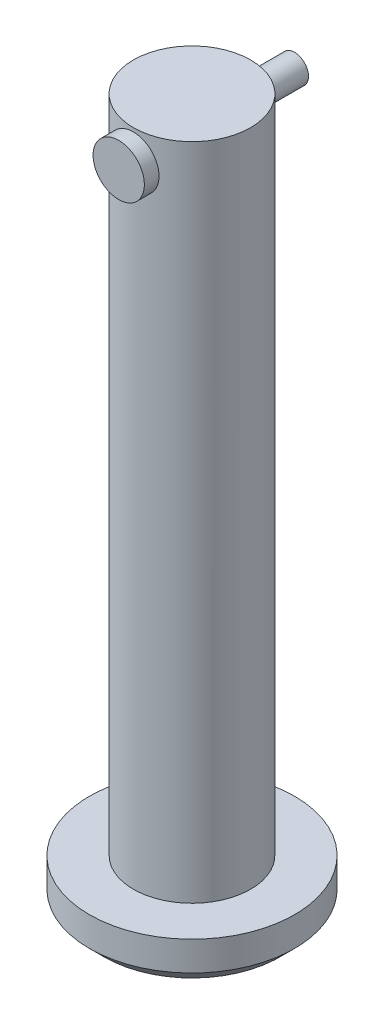
ISO-10303-21;
HEADER;
FILE_DESCRIPTION(('STEP AP214'),'2;1');
FILE_NAME('part.step','',(''),(''),'','','');
FILE_SCHEMA(('AUTOMOTIVE_DESIGN { 1 0 10303 214 1 1 1 1 }'));
ENDSEC;
DATA;
#1=APPLICATION_CONTEXT('core data for automotive mechanical design processes');
#2=APPLICATION_PROTOCOL_DEFINITION('international standard','automotive_design',2000,#1);
#3=PRODUCT_CONTEXT('',#1,'mechanical');
#4=PRODUCT('Part','Part','',(#3));
#5=PRODUCT_RELATED_PRODUCT_CATEGORY('part','',(#4));
#6=PRODUCT_DEFINITION_FORMATION('','',#4);
#7=PRODUCT_DEFINITION_CONTEXT('part definition',#1,'design');
#8=PRODUCT_DEFINITION('design','',#6,#7);
#9=PRODUCT_DEFINITION_SHAPE('','',#8);
#10=(LENGTH_UNIT() NAMED_UNIT(*) SI_UNIT(.MILLI.,.METRE.));
#11=(NAMED_UNIT(*) PLANE_ANGLE_UNIT() SI_UNIT($,.RADIAN.));
#12=(NAMED_UNIT(*) SI_UNIT($,.STERADIAN.) SOLID_ANGLE_UNIT());
#13=UNCERTAINTY_MEASURE_WITH_UNIT(LENGTH_MEASURE(1.E-05),#10,'distance_accuracy_value','');
#14=(GEOMETRIC_REPRESENTATION_CONTEXT(3) GLOBAL_UNCERTAINTY_ASSIGNED_CONTEXT((#13)) GLOBAL_UNIT_ASSIGNED_CONTEXT((#10,
#11,#12)) REPRESENTATION_CONTEXT('',''));
#15=CARTESIAN_POINT('',(0.,0.,0.));
#16=DIRECTION('',(0.,0.,1.));
#17=DIRECTION('',(1.,0.,0.));
#18=AXIS2_PLACEMENT_3D('',#15,#16,#17);
#19=CARTESIAN_POINT('',(0.,43.,-7.));
#20=DIRECTION('',(0.,0.,1.));
#21=DIRECTION('',(1.,0.,0.));
#22=AXIS2_PLACEMENT_3D('',#19,#20,#21);
#23=CYLINDRICAL_SURFACE('',#22,0.95);
#24=CARTESIAN_POINT('',(0.,43.,-7.));
#25=DIRECTION('',(0.,0.,1.));
#26=DIRECTION('',(1.,0.,0.));
#27=AXIS2_PLACEMENT_3D('',#24,#25,#26);
#28=CIRCLE('',#27,0.95);
#29=CARTESIAN_POINT('',(0.95,43.,-7.));
#30=VERTEX_POINT('',#29);
#31=EDGE_CURVE('E11',#30,#30,#28,.T.);
#32=ORIENTED_EDGE('',*,*,#31,.T.);
#33=EDGE_LOOP('',(#32));
#34=FACE_BOUND('',#33,.T.);
#35=CARTESIAN_POINT('',(0.,43.,4.));
#36=DIRECTION('',(0.,0.,1.));
#37=DIRECTION('',(1.,0.,0.));
#38=AXIS2_PLACEMENT_3D('',#35,#36,#37);
#39=CIRCLE('',#38,0.95);
#40=CARTESIAN_POINT('',(0.95,43.,4.));
#41=VERTEX_POINT('',#40);
#42=EDGE_CURVE('E41',#41,#41,#39,.F.);
#43=ORIENTED_EDGE('',*,*,#42,.T.);
#44=EDGE_LOOP('',(#43));
#45=FACE_BOUND('',#44,.T.);
#46=ADVANCED_FACE('F38',(#34,#45),#23,.T.);
#47=CARTESIAN_POINT('',(0.,43.,-7.));
#48=DIRECTION('',(0.,0.,1.));
#49=DIRECTION('',(1.,0.,0.));
#50=AXIS2_PLACEMENT_3D('',#47,#48,#49);
#51=PLANE('',#50);
#52=ORIENTED_EDGE('',*,*,#31,.F.);
#53=EDGE_LOOP('',(#52));
#54=FACE_BOUND('',#53,.T.);
#55=ADVANCED_FACE('F70',(#54),#51,.F.);
#56=CARTESIAN_POINT('',(0.,43.,4.));
#57=DIRECTION('',(0.,0.,1.));
#58=DIRECTION('',(1.,0.,0.));
#59=AXIS2_PLACEMENT_3D('',#56,#57,#58);
#60=CYLINDRICAL_SURFACE('',#59,1.75);
#61=CARTESIAN_POINT('',(0.,43.,4.));
#62=DIRECTION('',(0.,0.,1.));
#63=DIRECTION('',(1.,0.,0.));
#64=AXIS2_PLACEMENT_3D('',#61,#62,#63);
#65=CIRCLE('',#64,1.75);
#66=CARTESIAN_POINT('',(1.75,43.,4.));
#67=VERTEX_POINT('',#66);
#68=EDGE_CURVE('E48',#67,#67,#65,.T.);
#69=ORIENTED_EDGE('',*,*,#68,.T.);
#70=EDGE_LOOP('',(#69));
#71=FACE_BOUND('',#70,.T.);
#72=CARTESIAN_POINT('',(0.,43.,5.));
#73=DIRECTION('',(0.,0.,1.));
#74=DIRECTION('',(1.,0.,0.));
#75=AXIS2_PLACEMENT_3D('',#72,#73,#74);
#76=CIRCLE('',#75,1.75);
#77=CARTESIAN_POINT('',(1.75,43.,5.));
#78=VERTEX_POINT('',#77);
#79=EDGE_CURVE('E50',#78,#78,#76,.T.);
#80=ORIENTED_EDGE('',*,*,#79,.F.);
#81=EDGE_LOOP('',(#80));
#82=FACE_BOUND('',#81,.T.);
#83=ADVANCED_FACE('F56',(#71,#82),#60,.T.);
#84=CARTESIAN_POINT('',(0.,43.,4.));
#85=DIRECTION('',(0.,0.,1.));
#86=DIRECTION('',(1.,0.,0.));
#87=AXIS2_PLACEMENT_3D('',#84,#85,#86);
#88=PLANE('',#87);
#89=ORIENTED_EDGE('',*,*,#42,.F.);
#90=EDGE_LOOP('',(#89));
#91=FACE_BOUND('',#90,.T.);
#92=ORIENTED_EDGE('',*,*,#68,.F.);
#93=EDGE_LOOP('',(#92));
#94=FACE_BOUND('',#93,.T.);
#95=ADVANCED_FACE('F59',(#91,#94),#88,.F.);
#96=CARTESIAN_POINT('',(0.,43.,5.));
#97=DIRECTION('',(0.,0.,1.));
#98=DIRECTION('',(1.,0.,0.));
#99=AXIS2_PLACEMENT_3D('',#96,#97,#98);
#100=PLANE('',#99);
#101=ORIENTED_EDGE('',*,*,#79,.T.);
#102=EDGE_LOOP('',(#101));
#103=FACE_BOUND('',#102,.T.);
#104=ADVANCED_FACE('F61',(#103),#100,.T.);
#105=CLOSED_SHELL('',(#46,#55,#83,#95,#104));
#106=MANIFOLD_SOLID_BREP('B2',#105);
#107=CARTESIAN_POINT('',(0.,45.,0.));
#108=DIRECTION('',(0.,-1.,0.));
#109=DIRECTION('',(0.,0.,-1.));
#110=AXIS2_PLACEMENT_3D('',#107,#108,#109);
#111=CYLINDRICAL_SURFACE('',#110,4.);
#112=CARTESIAN_POINT('',(0.,45.,0.));
#113=DIRECTION('',(0.,1.,0.));
#114=DIRECTION('',(0.,0.,1.));
#115=AXIS2_PLACEMENT_3D('',#112,#113,#114);
#116=CIRCLE('',#115,4.);
#117=CARTESIAN_POINT('',(0.,45.,4.));
#118=VERTEX_POINT('',#117);
#119=EDGE_CURVE('E128',#118,#118,#116,.T.);
#120=ORIENTED_EDGE('',*,*,#119,.F.);
#121=EDGE_LOOP('',(#120));
#122=FACE_BOUND('',#121,.T.);
#123=CARTESIAN_POINT('',(0.,0.,0.));
#124=DIRECTION('',(0.,-1.,0.));
#125=DIRECTION('',(0.,0.,-1.));
#126=AXIS2_PLACEMENT_3D('',#123,#124,#125);
#127=CIRCLE('',#126,4.);
#128=CARTESIAN_POINT('',(0.,0.,-4.));
#129=VERTEX_POINT('',#128);
#130=EDGE_CURVE('E163',#129,#129,#127,.T.);
#131=ORIENTED_EDGE('',*,*,#130,.F.);
#132=EDGE_LOOP('',(#131));
#133=FACE_BOUND('',#132,.T.);
#134=CARTESIAN_POINT('',(-1.,43.,3.87298334620742));
#135=CARTESIAN_POINT('',(-0.9999984314387,42.9447796996432,3.87298440057185));
#136=CARTESIAN_POINT('',(-0.99541049820807,42.8895420405686,3.87417722499278));
#137=CARTESIAN_POINT('',(-0.977209250194448,42.7806529687674,3.87880744892249));
#138=CARTESIAN_POINT('',(-0.963590682698079,42.72700249822,3.8822461547418));
#139=CARTESIAN_POINT('',(-0.927796479849635,42.6228785847122,3.89095489813012));
#140=CARTESIAN_POINT('',(-0.905631891140941,42.5724011378422,3.8962225706936));
#141=CARTESIAN_POINT('',(-0.853408456505403,42.4758756589875,3.90799276818327));
#142=CARTESIAN_POINT('',(-0.823349275424503,42.4298278151688,3.91449534553241));
#143=CARTESIAN_POINT('',(-0.755483370924518,42.3424553418942,3.92816286540368));
#144=CARTESIAN_POINT('',(-0.717534755081558,42.3012425598597,3.93533839048709));
#145=CARTESIAN_POINT('',(-0.635272825640328,42.2256954422561,3.94945150206622));
#146=CARTESIAN_POINT('',(-0.59095891767214,42.1913617497514,3.95638906626691));
#147=CARTESIAN_POINT('',(-0.496458080431566,42.1300898129474,3.96936166208095));
#148=CARTESIAN_POINT('',(-0.446197830478045,42.1032614447354,3.975382749602));
#149=CARTESIAN_POINT('',(-0.341705273717112,42.0584761423388,3.9857232477043));
#150=CARTESIAN_POINT('',(-0.28747355431678,42.0405178992338,3.99004290933747));
#151=CARTESIAN_POINT('',(-0.177743503501667,42.0143408661686,3.99641903539262));
#152=CARTESIAN_POINT('',(-0.122293087819594,42.0059321422694,3.99851957537723));
#153=CARTESIAN_POINT('',(-0.0107315277051117,41.9984966482898,4.00037437642922));
#154=CARTESIAN_POINT('',(0.045379517815224,41.9994684911162,4.00012898438682));
#155=CARTESIAN_POINT('',(0.155352247172384,42.0106299401001,3.99735237981413));
#156=CARTESIAN_POINT('',(0.209236215601063,42.0206145300215,3.99487200936349));
#157=CARTESIAN_POINT('',(0.314538247413682,42.0491885080194,3.98796334609942));
#158=CARTESIAN_POINT('',(0.365956179370435,42.067778354151,3.98353494959376));
#159=CARTESIAN_POINT('',(0.465406703501804,42.1132010282748,3.97315003880358));
#160=CARTESIAN_POINT('',(0.513404509766501,42.1401068178647,3.96718007878021));
#161=CARTESIAN_POINT('',(0.604275622340485,42.2013422716465,3.9543596152386));
#162=CARTESIAN_POINT('',(0.647148035085502,42.2356732274242,3.94750895860996));
#163=CARTESIAN_POINT('',(0.727774035084955,42.3118834967929,3.93345485507808));
#164=CARTESIAN_POINT('',(0.765357679075198,42.3539419569391,3.92624687810367));
#165=CARTESIAN_POINT('',(0.832976375963017,42.4438399894161,3.91246017406683));
#166=CARTESIAN_POINT('',(0.863011076046014,42.4916798317964,3.90588147642388));
#167=CARTESIAN_POINT('',(0.914788129022598,42.5921160136596,3.89408198732659));
#168=CARTESIAN_POINT('',(0.936489566970493,42.6447342921253,3.88886793490288));
#169=CARTESIAN_POINT('',(0.970685620636343,42.7530341872306,3.88047456055983));
#170=CARTESIAN_POINT('',(0.983182206552911,42.8087151455933,3.87729480324087));
#171=CARTESIAN_POINT('',(0.998331855466071,42.9199838006092,3.87342142415656));
#172=CARTESIAN_POINT('',(1.00123618956785,42.9755351173318,3.87266435637459));
#173=CARTESIAN_POINT('',(0.99780679620622,43.0863287746313,3.87354937392416));
#174=CARTESIAN_POINT('',(0.991473919139521,43.1415711431805,3.87519123840506));
#175=CARTESIAN_POINT('',(0.969970185575067,43.2492457059819,3.88062832781824));
#176=CARTESIAN_POINT('',(0.954945627312701,43.3017090906283,3.8843878809375));
#177=CARTESIAN_POINT('',(0.916647232668251,43.4033725831407,3.89360287308385));
#178=CARTESIAN_POINT('',(0.89337241908502,43.4525723036221,3.89905851299445));
#179=CARTESIAN_POINT('',(0.838708267174625,43.5473765111469,3.91118454837305));
#180=CARTESIAN_POINT('',(0.807168701534253,43.5928915360172,3.91787667442657));
#181=CARTESIAN_POINT('',(0.737060292934457,43.6780753451205,3.93166833228686));
#182=CARTESIAN_POINT('',(0.698490294805439,43.71774316666,3.93876793091388));
#183=CARTESIAN_POINT('',(0.614262720984724,43.7911244170284,3.95278961212643));
#184=CARTESIAN_POINT('',(0.568451952531592,43.8246640250195,3.95970280824734));
#185=CARTESIAN_POINT('',(0.471702682694676,43.8835743467805,3.97238886645494));
#186=CARTESIAN_POINT('',(0.420764448957593,43.9089454866433,3.97816178801584));
#187=CARTESIAN_POINT('',(0.315558201731094,43.9505784138112,3.98788046295326));
#188=CARTESIAN_POINT('',(0.261317381027885,43.9669057137516,3.99183932008964));
#189=CARTESIAN_POINT('',(0.150749760318812,43.9901841338434,3.99754117358315));
#190=CARTESIAN_POINT('',(0.0944233650412474,43.9971370634956,3.99928459757363));
#191=CARTESIAN_POINT('',(-0.0170835264433232,44.0013675895755,4.00034169408811));
#192=CARTESIAN_POINT('',(-0.0722538269660304,43.9989017090954,3.99971978880008));
#193=CARTESIAN_POINT('',(-0.181367496414737,43.9849521727057,3.99625896457423));
#194=CARTESIAN_POINT('',(-0.235310901780884,43.9734687849869,3.99342011157094));
#195=CARTESIAN_POINT('',(-0.340171035644814,43.9419477802291,3.98585432853963));
#196=CARTESIAN_POINT('',(-0.391102494581017,43.9219565466854,3.98113764502669));
#197=CARTESIAN_POINT('',(-0.488917053041466,43.8740294209807,3.97031288913382));
#198=CARTESIAN_POINT('',(-0.535799641265048,43.8460925273304,3.96420464137727));
#199=CARTESIAN_POINT('',(-0.625401928423897,43.7822847660029,3.95107249681342));
#200=CARTESIAN_POINT('',(-0.667994988300584,43.7462398570926,3.94403016945647));
#201=CARTESIAN_POINT('',(-0.74661502027125,43.6675771480262,3.92990649053207));
#202=CARTESIAN_POINT('',(-0.782640325068177,43.6249576839021,3.92282512952424));
#203=CARTESIAN_POINT('',(-0.847762026479239,43.5333985857987,3.90927475860683));
#204=CARTESIAN_POINT('',(-0.876716619446591,43.4843558765875,3.90281963730391));
#205=CARTESIAN_POINT('',(-0.92592689661562,43.3819445100772,3.8914395555011));
#206=CARTESIAN_POINT('',(-0.946188909759556,43.3285790338927,3.88651348244814));
#207=CARTESIAN_POINT('',(-0.974422528565572,43.2294229881737,3.87951908741315));
#208=CARTESIAN_POINT('',(-0.983993170595829,43.1841068356176,3.87708663005761));
#209=CARTESIAN_POINT('',(-0.996782292572819,43.0925311309985,3.87381838580358));
#210=CARTESIAN_POINT('',(-1.00000131437052,43.0462716597494,3.87298246270638));
#211=CARTESIAN_POINT('',(-1.,43.,3.87298334620742));
#212=B_SPLINE_CURVE_WITH_KNOTS('',3,(#134,#135,#136,#137,#138,#139,#140,#141,#142,#143,#144,
#145,#146,#147,#148,#149,#150,#151,#152,#153,#154,#155,#156,#157,#158,#159,#160,#161,#162,#163,
#164,#165,#166,#167,#168,#169,#170,#171,#172,#173,#174,#175,#176,#177,#178,#179,#180,#181,#182,
#183,#184,#185,#186,#187,#188,#189,#190,#191,#192,#193,#194,#195,#196,#197,#198,#199,#200,#201,
#202,#203,#204,#205,#206,#207,#208,#209,#210,#211),.UNSPECIFIED.,.T.,.F.,(4,2,2,2,2,2,2,2,2,2,2,
2,2,2,2,2,2,2,2,2,2,2,2,2,2,2,2,2,2,2,2,2,2,2,2,2,2,2,4),(0.,0.165490976675224,
0.331078296534208,0.496452290829168,0.66183330698466,0.830495816734648,0.99917408588221,
1.17020598555442,1.34121263935111,1.50875500394413,1.67627259462682,1.84007305071853,
2.00388222686189,2.16917149698052,2.33448954183839,2.50428186625039,2.67408212476195,
2.84470572799636,3.01529280048094,3.18137429900961,3.34744050869795,3.51078961999957,
3.67415808564842,3.84073138339938,4.00733207550293,4.17810132382402,4.34886166284096,
4.51836829119046,4.6878421955989,4.85273378447257,5.01762046947067,5.18161950620159,
5.34563922291503,5.51358838629103,5.68158012622478,5.85270590910145,6.02370688542922,
6.16239130867207,6.30106390036083),.UNSPECIFIED.);
#213=CARTESIAN_POINT('',(-1.,43.,3.87298334620742));
#214=VERTEX_POINT('',#213);
#215=EDGE_CURVE('E131',#214,#214,#212,.T.);
#216=ORIENTED_EDGE('',*,*,#215,.F.);
#217=EDGE_LOOP('',(#216));
#218=FACE_BOUND('',#217,.T.);
#219=CARTESIAN_POINT('',(0.,44.,-4.));
#220=CARTESIAN_POINT('',(0.0552507257798211,43.9999984495079,-3.99999906578675));
#221=CARTESIAN_POINT('',(0.110518771887176,43.9954056328175,-3.99884385421219));
#222=CARTESIAN_POINT('',(0.219470882513689,43.977183232462,-3.99434742553261));
#223=CARTESIAN_POINT('',(0.27315403124716,43.9635485269748,-3.99100496946646));
#224=CARTESIAN_POINT('',(0.37734724812172,43.9277071643586,-3.98250417554693));
#225=CARTESIAN_POINT('',(0.427861042286672,43.9055108008565,-3.97734801894724));
#226=CARTESIAN_POINT('',(0.524448087936288,43.8532124066368,-3.96576895871729));
#227=CARTESIAN_POINT('',(0.570521189565842,43.823110109254,-3.95934601236034));
#228=CARTESIAN_POINT('',(0.657867951533948,43.7551994735639,-3.94578275727867));
#229=CARTESIAN_POINT('',(0.699037126707383,43.7172589500272,-3.93863138099022));
#230=CARTESIAN_POINT('',(0.774499284802205,43.635031863394,-3.92449080078353));
#231=CARTESIAN_POINT('',(0.808791491299426,43.5907445847023,-3.91750161525566));
#232=CARTESIAN_POINT('',(0.870017695199358,43.4962698488417,-3.9043651713314));
#233=CARTESIAN_POINT('',(0.896834810616906,43.4460045127931,-3.89823196313737));
#234=CARTESIAN_POINT('',(0.941597939033685,43.3415010588944,-3.88766329874815));
#235=CARTESIAN_POINT('',(0.959545370292889,43.2872635777828,-3.88322757115192));
#236=CARTESIAN_POINT('',(0.985703224536195,43.1775043345317,-3.87666984478367));
#237=CARTESIAN_POINT('',(0.994101512222227,43.1220300693001,-3.87450327383617));
#238=CARTESIAN_POINT('',(1.00150785004524,43.0104209539907,-3.87259575025161));
#239=CARTESIAN_POINT('',(1.00051742787865,42.9542862128676,-3.87285440299096));
#240=CARTESIAN_POINT('',(0.98932434975952,42.8443894615037,-3.87572803664412));
#241=CARTESIAN_POINT('',(0.979345560127012,42.7906029190233,-3.87828575334586));
#242=CARTESIAN_POINT('',(0.95081612460207,42.6854926327258,-3.88537806450989));
#243=CARTESIAN_POINT('',(0.932264868046281,42.6341690646473,-3.88991279980464));
#244=CARTESIAN_POINT('',(0.886926318624768,42.5348413224986,-3.90050075936124));
#245=CARTESIAN_POINT('',(0.860057778155272,42.4868758854736,-3.90656884979614));
#246=CARTESIAN_POINT('',(0.798904184009968,42.3960541934954,-3.91953140564257));
#247=CARTESIAN_POINT('',(0.764617832539224,42.3531988346218,-3.9264260155649));
#248=CARTESIAN_POINT('',(0.688442283120809,42.2725309228704,-3.94050587026521));
#249=CARTESIAN_POINT('',(0.646364172110569,42.2348970066258,-3.94769379651981));
#250=CARTESIAN_POINT('',(0.556407945002461,42.1671858383574,-3.96137310385857));
#251=CARTESIAN_POINT('',(0.50852965180529,42.1371088171576,-3.96786446366277));
#252=CARTESIAN_POINT('',(0.408077259120922,42.0852996091837,-3.97945154729455));
#253=CARTESIAN_POINT('',(0.35548759547241,42.0635964398304,-3.9845424008515));
#254=CARTESIAN_POINT('',(0.247250672095251,42.0293884628603,-3.99271944660946));
#255=CARTESIAN_POINT('',(0.191603999433652,42.0168818957212,-3.99580602226187));
#256=CARTESIAN_POINT('',(0.0803599802600136,42.0016949562941,-3.9995699951425));
#257=CARTESIAN_POINT('',(0.0247978133254691,41.9987713159498,-4.00030702338852));
#258=CARTESIAN_POINT('',(-0.0860219165343424,42.0021660013703,-3.999458698763));
#259=CARTESIAN_POINT('',(-0.141279506429733,42.0084834951994,-3.99787355494564));
#260=CARTESIAN_POINT('',(-0.249076179184331,42.0299806055942,-3.99259720751571));
#261=CARTESIAN_POINT('',(-0.30164341264584,42.0450275089847,-3.98893756123874));
#262=CARTESIAN_POINT('',(-0.403504861635011,42.0834047226856,-3.97992471089423));
#263=CARTESIAN_POINT('',(-0.452798746021759,42.1067358695421,-3.97457133579928));
#264=CARTESIAN_POINT('',(-0.5476820896199,42.1614907525831,-3.96262205284207));
#265=CARTESIAN_POINT('',(-0.593190294557221,42.1930507415978,-3.95600578244621));
#266=CARTESIAN_POINT('',(-0.678351075762165,42.2631932725313,-3.94229672791613));
#267=CARTESIAN_POINT('',(-0.71800263931534,42.3017770264113,-3.93520386167803));
#268=CARTESIAN_POINT('',(-0.791327045381822,42.3860013072296,-3.92112637973847));
#269=CARTESIAN_POINT('',(-0.824829245081355,42.4317918020016,-3.91414869458187));
#270=CARTESIAN_POINT('',(-0.883673839341799,42.5284884229771,-3.90128585584826));
#271=CARTESIAN_POINT('',(-0.909016596105293,42.5793943219732,-3.89540065378017));
#272=CARTESIAN_POINT('',(-0.950634280406197,42.684603814942,-3.88545396489777));
#273=CARTESIAN_POINT('',(-0.966962931102711,42.7388850855627,-3.88138170194604));
#274=CARTESIAN_POINT('',(-0.990230439969186,42.8495397585927,-3.87551162726789));
#275=CARTESIAN_POINT('',(-0.997171351652439,42.9059127006883,-3.87371331813291));
#276=CARTESIAN_POINT('',(-1.00135906022266,43.0174140159035,-3.87263267469304));
#277=CARTESIAN_POINT('',(-0.99887859852008,43.0725316234165,-3.87327955152176));
#278=CARTESIAN_POINT('',(-0.984918185541911,43.1815359257787,-3.87685272671895));
#279=CARTESIAN_POINT('',(-0.973438415124512,43.2354226453424,-3.87977897927904));
#280=CARTESIAN_POINT('',(-0.941954212961862,43.3401389727103,-3.88754173788482));
#281=CARTESIAN_POINT('',(-0.922000936453583,43.3909848701601,-3.89236676824206));
#282=CARTESIAN_POINT('',(-0.874176609070046,43.4886435884758,-3.90338503816552));
#283=CARTESIAN_POINT('',(-0.846304460022792,43.5354558487913,-3.90957846747182));
#284=CARTESIAN_POINT('',(-0.782578499091425,43.6250364193347,-3.92283756175675));
#285=CARTESIAN_POINT('',(-0.746535441941504,43.6676673822826,-3.92992176554505));
#286=CARTESIAN_POINT('',(-0.667859580793158,43.7463646965303,-3.94405351497524));
#287=CARTESIAN_POINT('',(-0.625225214174097,43.782429486742,-3.95110105151373));
#288=CARTESIAN_POINT('',(-0.533645057801727,43.8476075390431,-3.96451770431775));
#289=CARTESIAN_POINT('',(-0.484598948210926,43.876583075781,-3.97087222243912));
#290=CARTESIAN_POINT('',(-0.382177373006986,43.9258316419604,-3.98203283316746));
#291=CARTESIAN_POINT('',(-0.32880504229116,43.946110907099,-3.98684003466521));
#292=CARTESIAN_POINT('',(-0.229606835495647,43.9743812202198,-3.99365373043694));
#293=CARTESIAN_POINT('',(-0.184253447272045,43.983967495369,-3.9960172336846));
#294=CARTESIAN_POINT('',(-0.0926040476908554,43.996777295748,-3.99919070154632));
#295=CARTESIAN_POINT('',(-0.0463081074950776,44.0000012995369,-4.00000078300596));
#296=CARTESIAN_POINT('',(0.,44.,-4.));
#297=B_SPLINE_CURVE_WITH_KNOTS('',3,(#219,#220,#221,#222,#223,#224,#225,#226,#227,#228,#229,
#230,#231,#232,#233,#234,#235,#236,#237,#238,#239,#240,#241,#242,#243,#244,#245,#246,#247,#248,
#249,#250,#251,#252,#253,#254,#255,#256,#257,#258,#259,#260,#261,#262,#263,#264,#265,#266,#267,
#268,#269,#270,#271,#272,#273,#274,#275,#276,#277,#278,#279,#280,#281,#282,#283,#284,#285,#286,
#287,#288,#289,#290,#291,#292,#293,#294,#295,#296),.UNSPECIFIED.,.T.,.F.,(4,2,2,2,2,2,2,2,2,2,2,
2,2,2,2,2,2,2,2,2,2,2,2,2,2,2,2,2,2,2,2,2,2,2,2,2,2,2,4),(0.,0.165582474981261,
0.331258825175935,0.496736601524074,0.662219960112887,0.830762902914266,0.999324863867081,
1.17039098363872,1.34142974112912,1.50904196732954,1.67662692075132,1.84014998004679,
2.0036846897736,2.16887018582587,2.33408460557443,2.50401000646014,2.67394059705499,
2.84445486006077,3.01493649125763,3.18105539299518,3.34715934075163,3.51080183009359,
3.67446084881528,3.84102391710235,4.0076157533868,4.17829672802984,4.34897012499672,
4.51861503076025,4.68822282168272,4.85295853599076,5.0176909397069,5.18144267039632,
5.34521712091268,5.51326384273274,5.68135046513612,5.85248123666392,6.02348909214234,
6.16228161961433,6.30106370695361),.UNSPECIFIED.);
#298=CARTESIAN_POINT('',(0.,44.,-4.));
#299=VERTEX_POINT('',#298);
#300=EDGE_CURVE('E115',#299,#299,#297,.T.);
#301=ORIENTED_EDGE('',*,*,#300,.F.);
#302=EDGE_LOOP('',(#301));
#303=FACE_BOUND('',#302,.T.);
#304=ADVANCED_FACE('F111',(#122,#133,#218,#303),#111,.T.);
#305=CARTESIAN_POINT('',(0.,45.,0.));
#306=DIRECTION('',(0.,1.,0.));
#307=DIRECTION('',(0.,0.,1.));
#308=AXIS2_PLACEMENT_3D('',#305,#306,#307);
#309=PLANE('',#308);
#310=ORIENTED_EDGE('',*,*,#119,.T.);
#311=EDGE_LOOP('',(#310));
#312=FACE_BOUND('',#311,.T.);
#313=ADVANCED_FACE('F154',(#312),#309,.T.);
#314=CARTESIAN_POINT('',(0.,-3.,0.));
#315=DIRECTION('',(0.,1.,0.));
#316=DIRECTION('',(0.,0.,1.));
#317=AXIS2_PLACEMENT_3D('',#314,#315,#316);
#318=CYLINDRICAL_SURFACE('',#317,7.);
#319=CARTESIAN_POINT('',(0.,-2.,0.));
#320=DIRECTION('',(0.,-1.,0.));
#321=DIRECTION('',(0.,0.,-1.));
#322=AXIS2_PLACEMENT_3D('',#319,#320,#321);
#323=CIRCLE('',#322,7.);
#324=CARTESIAN_POINT('',(0.,-2.,-7.));
#325=VERTEX_POINT('',#324);
#326=EDGE_CURVE('E37',#325,#325,#323,.F.);
#327=ORIENTED_EDGE('',*,*,#326,.T.);
#328=EDGE_LOOP('',(#327));
#329=FACE_BOUND('',#328,.T.);
#330=CARTESIAN_POINT('',(0.,0.,0.));
#331=DIRECTION('',(0.,-1.,0.));
#332=DIRECTION('',(0.,0.,-1.));
#333=AXIS2_PLACEMENT_3D('',#330,#331,#332);
#334=CIRCLE('',#333,7.);
#335=CARTESIAN_POINT('',(0.,0.,-7.));
#336=VERTEX_POINT('',#335);
#337=EDGE_CURVE('E165',#336,#336,#334,.T.);
#338=ORIENTED_EDGE('',*,*,#337,.T.);
#339=EDGE_LOOP('',(#338));
#340=FACE_BOUND('',#339,.T.);
#341=ADVANCED_FACE('F148',(#329,#340),#318,.T.);
#342=CARTESIAN_POINT('',(0.,-3.,0.));
#343=DIRECTION('',(0.,-1.,0.));
#344=DIRECTION('',(0.,0.,-1.));
#345=AXIS2_PLACEMENT_3D('',#342,#343,#344);
#346=PLANE('',#345);
#347=CARTESIAN_POINT('',(0.,-3.,0.));
#348=DIRECTION('',(0.,-1.,0.));
#349=DIRECTION('',(0.,0.,-1.));
#350=AXIS2_PLACEMENT_3D('',#347,#348,#349);
#351=CIRCLE('',#350,6.00000000000001);
#352=CARTESIAN_POINT('',(0.,-3.,-6.00000000000001));
#353=VERTEX_POINT('',#352);
#354=EDGE_CURVE('E123',#353,#353,#351,.T.);
#355=ORIENTED_EDGE('',*,*,#354,.T.);
#356=EDGE_LOOP('',(#355));
#357=FACE_BOUND('',#356,.T.);
#358=ADVANCED_FACE('F143',(#357),#346,.T.);
#359=CARTESIAN_POINT('',(0.,0.,0.));
#360=DIRECTION('',(0.,-1.,0.));
#361=DIRECTION('',(0.,0.,-1.));
#362=AXIS2_PLACEMENT_3D('',#359,#360,#361);
#363=PLANE('',#362);
#364=ORIENTED_EDGE('',*,*,#130,.T.);
#365=EDGE_LOOP('',(#364));
#366=FACE_BOUND('',#365,.T.);
#367=ORIENTED_EDGE('',*,*,#337,.F.);
#368=EDGE_LOOP('',(#367));
#369=FACE_BOUND('',#368,.T.);
#370=ADVANCED_FACE('F147',(#366,#369),#363,.F.);
#371=CARTESIAN_POINT('',(0.,-3.,0.));
#372=DIRECTION('',(0.,1.,0.));
#373=DIRECTION('',(0.,0.,1.));
#374=AXIS2_PLACEMENT_3D('',#371,#372,#373);
#375=CONICAL_SURFACE('',#374,6.00000000000001,0.785398163397447);
#376=ORIENTED_EDGE('',*,*,#326,.F.);
#377=EDGE_LOOP('',(#376));
#378=FACE_BOUND('',#377,.T.);
#379=ORIENTED_EDGE('',*,*,#354,.F.);
#380=EDGE_LOOP('',(#379));
#381=FACE_BOUND('',#380,.T.);
#382=ADVANCED_FACE('F113',(#378,#381),#375,.T.);
#383=CARTESIAN_POINT('',(0.,43.,10.));
#384=DIRECTION('',(0.,0.,-1.));
#385=DIRECTION('',(-1.,0.,0.));
#386=AXIS2_PLACEMENT_3D('',#383,#384,#385);
#387=CYLINDRICAL_SURFACE('',#386,1.);
#388=ORIENTED_EDGE('',*,*,#215,.T.);
#389=EDGE_LOOP('',(#388));
#390=FACE_BOUND('',#389,.T.);
#391=ORIENTED_EDGE('',*,*,#300,.T.);
#392=EDGE_LOOP('',(#391));
#393=FACE_BOUND('',#392,.T.);
#394=ADVANCED_FACE('F138',(#390,#393),#387,.F.);
#395=CLOSED_SHELL('',(#304,#313,#341,#358,#370,#382,#394));
#396=MANIFOLD_SOLID_BREP('B6',#395);
#397=ADVANCED_BREP_SHAPE_REPRESENTATION('',(#18,#106,#396),#14);
#398=SHAPE_DEFINITION_REPRESENTATION(#9,#397);
ENDSEC;
END-ISO-10303-21;
